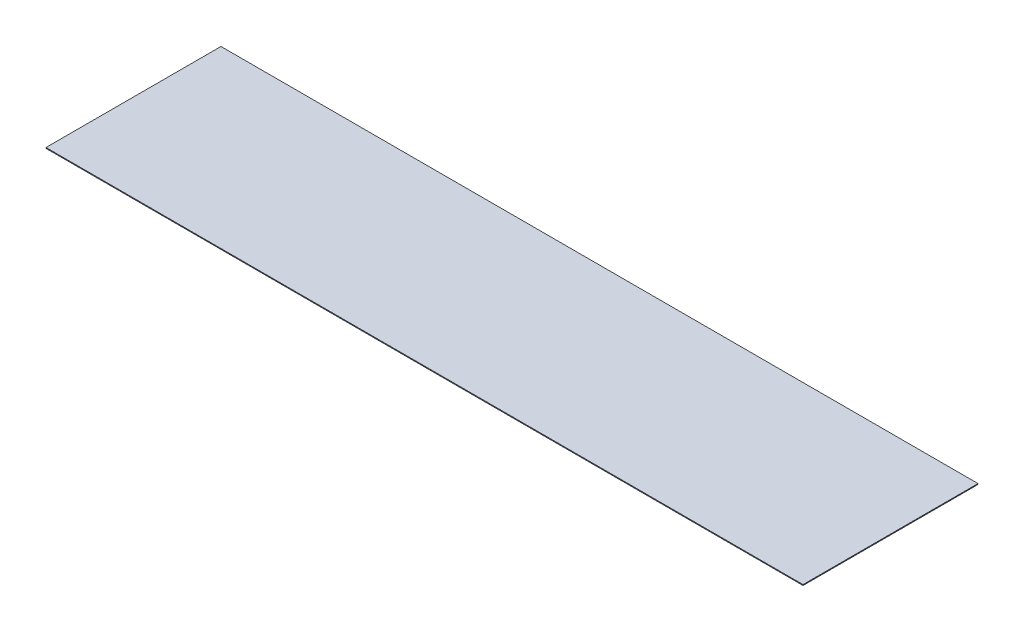
ISO-10303-21;
HEADER;
FILE_DESCRIPTION(('STEP AP214'),'2;1');
FILE_NAME('part.step','',(''),(''),'','','');
FILE_SCHEMA(('AUTOMOTIVE_DESIGN { 1 0 10303 214 1 1 1 1 }'));
ENDSEC;
DATA;
#1=APPLICATION_CONTEXT('core data for automotive mechanical design processes');
#2=APPLICATION_PROTOCOL_DEFINITION('international standard','automotive_design',2000,#1);
#3=PRODUCT_CONTEXT('',#1,'mechanical');
#4=PRODUCT('Part','Part','',(#3));
#5=PRODUCT_RELATED_PRODUCT_CATEGORY('part','',(#4));
#6=PRODUCT_DEFINITION_FORMATION('','',#4);
#7=PRODUCT_DEFINITION_CONTEXT('part definition',#1,'design');
#8=PRODUCT_DEFINITION('design','',#6,#7);
#9=PRODUCT_DEFINITION_SHAPE('','',#8);
#10=(LENGTH_UNIT() NAMED_UNIT(*) SI_UNIT(.MILLI.,.METRE.));
#11=(NAMED_UNIT(*) PLANE_ANGLE_UNIT() SI_UNIT($,.RADIAN.));
#12=(NAMED_UNIT(*) SI_UNIT($,.STERADIAN.) SOLID_ANGLE_UNIT());
#13=UNCERTAINTY_MEASURE_WITH_UNIT(LENGTH_MEASURE(1.E-05),#10,'distance_accuracy_value','');
#14=(GEOMETRIC_REPRESENTATION_CONTEXT(3) GLOBAL_UNCERTAINTY_ASSIGNED_CONTEXT((#13)) GLOBAL_UNIT_ASSIGNED_CONTEXT((#10,
#11,#12)) REPRESENTATION_CONTEXT('',''));
#15=CARTESIAN_POINT('',(0.,0.,0.));
#16=DIRECTION('',(0.,0.,1.));
#17=DIRECTION('',(1.,0.,0.));
#18=AXIS2_PLACEMENT_3D('',#15,#16,#17);
#19=CARTESIAN_POINT('',(900.,2.,-208.));
#20=DIRECTION('',(-1.,0.,0.));
#21=DIRECTION('',(0.,0.,1.));
#22=AXIS2_PLACEMENT_3D('',#19,#20,#21);
#23=PLANE('',#22);
#24=DIRECTION('',(0.,0.,-1.));
#25=VECTOR('',#24,1.);
#26=CARTESIAN_POINT('',(900.,0.,-208.));
#27=LINE('',#26,#25);
#28=CARTESIAN_POINT('',(900.,0.,208.));
#29=VERTEX_POINT('',#28);
#30=CARTESIAN_POINT('',(900.,0.,-208.));
#31=VERTEX_POINT('',#30);
#32=EDGE_CURVE('E96',#29,#31,#27,.T.);
#33=ORIENTED_EDGE('',*,*,#32,.T.);
#34=DIRECTION('',(0.,-1.,0.));
#35=VECTOR('',#34,1.);
#36=CARTESIAN_POINT('',(900.,2.,-208.));
#37=LINE('',#36,#35);
#38=CARTESIAN_POINT('',(900.,2.,-208.));
#39=VERTEX_POINT('',#38);
#40=EDGE_CURVE('E11',#39,#31,#37,.T.);
#41=ORIENTED_EDGE('',*,*,#40,.F.);
#42=DIRECTION('',(0.,0.,-1.));
#43=VECTOR('',#42,1.);
#44=CARTESIAN_POINT('',(900.,2.,-208.));
#45=LINE('',#44,#43);
#46=CARTESIAN_POINT('',(900.,2.,208.));
#47=VERTEX_POINT('',#46);
#48=EDGE_CURVE('E84',#47,#39,#45,.T.);
#49=ORIENTED_EDGE('',*,*,#48,.F.);
#50=DIRECTION('',(0.,-1.,0.));
#51=VECTOR('',#50,1.);
#52=CARTESIAN_POINT('',(900.,2.,208.));
#53=LINE('',#52,#51);
#54=EDGE_CURVE('E92',#47,#29,#53,.T.);
#55=ORIENTED_EDGE('',*,*,#54,.T.);
#56=EDGE_LOOP('',(#33,#41,#49,#55));
#57=FACE_BOUND('',#56,.T.);
#58=ADVANCED_FACE('F33',(#57),#23,.F.);
#59=CARTESIAN_POINT('',(-900.,2.,-208.));
#60=DIRECTION('',(0.,0.,1.));
#61=DIRECTION('',(1.,0.,0.));
#62=AXIS2_PLACEMENT_3D('',#59,#60,#61);
#63=PLANE('',#62);
#64=DIRECTION('',(-1.,0.,0.));
#65=VECTOR('',#64,1.);
#66=CARTESIAN_POINT('',(-900.,0.,-208.));
#67=LINE('',#66,#65);
#68=CARTESIAN_POINT('',(-900.,0.,-208.));
#69=VERTEX_POINT('',#68);
#70=EDGE_CURVE('E88',#31,#69,#67,.T.);
#71=ORIENTED_EDGE('',*,*,#70,.T.);
#72=DIRECTION('',(0.,-1.,0.));
#73=VECTOR('',#72,1.);
#74=CARTESIAN_POINT('',(-900.,2.,-208.));
#75=LINE('',#74,#73);
#76=CARTESIAN_POINT('',(-900.,2.,-208.));
#77=VERTEX_POINT('',#76);
#78=EDGE_CURVE('E41',#77,#69,#75,.T.);
#79=ORIENTED_EDGE('',*,*,#78,.F.);
#80=DIRECTION('',(-1.,0.,0.));
#81=VECTOR('',#80,1.);
#82=CARTESIAN_POINT('',(-900.,2.,-208.));
#83=LINE('',#82,#81);
#84=EDGE_CURVE('E79',#39,#77,#83,.T.);
#85=ORIENTED_EDGE('',*,*,#84,.F.);
#86=ORIENTED_EDGE('',*,*,#40,.T.);
#87=EDGE_LOOP('',(#71,#79,#85,#86));
#88=FACE_BOUND('',#87,.T.);
#89=ADVANCED_FACE('F87',(#88),#63,.F.);
#90=CARTESIAN_POINT('',(-900.,2.,-208.));
#91=DIRECTION('',(1.,0.,0.));
#92=DIRECTION('',(0.,0.,-1.));
#93=AXIS2_PLACEMENT_3D('',#90,#91,#92);
#94=PLANE('',#93);
#95=DIRECTION('',(0.,0.,1.));
#96=VECTOR('',#95,1.);
#97=CARTESIAN_POINT('',(-900.,0.,-208.));
#98=LINE('',#97,#96);
#99=CARTESIAN_POINT('',(-900.,0.,208.));
#100=VERTEX_POINT('',#99);
#101=EDGE_CURVE('E66',#69,#100,#98,.T.);
#102=ORIENTED_EDGE('',*,*,#101,.T.);
#103=DIRECTION('',(0.,-1.,0.));
#104=VECTOR('',#103,1.);
#105=CARTESIAN_POINT('',(-900.,2.,208.));
#106=LINE('',#105,#104);
#107=CARTESIAN_POINT('',(-900.,2.,208.));
#108=VERTEX_POINT('',#107);
#109=EDGE_CURVE('E89',#108,#100,#106,.T.);
#110=ORIENTED_EDGE('',*,*,#109,.F.);
#111=DIRECTION('',(0.,0.,1.));
#112=VECTOR('',#111,1.);
#113=CARTESIAN_POINT('',(-900.,2.,-208.));
#114=LINE('',#113,#112);
#115=EDGE_CURVE('E82',#77,#108,#114,.T.);
#116=ORIENTED_EDGE('',*,*,#115,.F.);
#117=ORIENTED_EDGE('',*,*,#78,.T.);
#118=EDGE_LOOP('',(#102,#110,#116,#117));
#119=FACE_BOUND('',#118,.T.);
#120=ADVANCED_FACE('F90',(#119),#94,.F.);
#121=CARTESIAN_POINT('',(-900.,2.,208.));
#122=DIRECTION('',(0.,0.,-1.));
#123=DIRECTION('',(-1.,0.,0.));
#124=AXIS2_PLACEMENT_3D('',#121,#122,#123);
#125=PLANE('',#124);
#126=DIRECTION('',(1.,0.,0.));
#127=VECTOR('',#126,1.);
#128=CARTESIAN_POINT('',(-900.,0.,208.));
#129=LINE('',#128,#127);
#130=EDGE_CURVE('E72',#100,#29,#129,.T.);
#131=ORIENTED_EDGE('',*,*,#130,.T.);
#132=ORIENTED_EDGE('',*,*,#54,.F.);
#133=DIRECTION('',(1.,0.,0.));
#134=VECTOR('',#133,1.);
#135=CARTESIAN_POINT('',(-900.,2.,208.));
#136=LINE('',#135,#134);
#137=EDGE_CURVE('E49',#108,#47,#136,.T.);
#138=ORIENTED_EDGE('',*,*,#137,.F.);
#139=ORIENTED_EDGE('',*,*,#109,.T.);
#140=EDGE_LOOP('',(#131,#132,#138,#139));
#141=FACE_BOUND('',#140,.T.);
#142=ADVANCED_FACE('F103',(#141),#125,.F.);
#143=CARTESIAN_POINT('',(0.,2.,0.));
#144=DIRECTION('',(0.,1.,0.));
#145=DIRECTION('',(0.,0.,1.));
#146=AXIS2_PLACEMENT_3D('',#143,#144,#145);
#147=PLANE('',#146);
#148=ORIENTED_EDGE('',*,*,#48,.T.);
#149=ORIENTED_EDGE('',*,*,#84,.T.);
#150=ORIENTED_EDGE('',*,*,#115,.T.);
#151=ORIENTED_EDGE('',*,*,#137,.T.);
#152=EDGE_LOOP('',(#148,#149,#150,#151));
#153=FACE_BOUND('',#152,.T.);
#154=ADVANCED_FACE('F80',(#153),#147,.T.);
#155=CARTESIAN_POINT('',(0.,0.,0.));
#156=DIRECTION('',(0.,1.,0.));
#157=DIRECTION('',(0.,0.,1.));
#158=AXIS2_PLACEMENT_3D('',#155,#156,#157);
#159=PLANE('',#158);
#160=ORIENTED_EDGE('',*,*,#32,.F.);
#161=ORIENTED_EDGE('',*,*,#130,.F.);
#162=ORIENTED_EDGE('',*,*,#101,.F.);
#163=ORIENTED_EDGE('',*,*,#70,.F.);
#164=EDGE_LOOP('',(#160,#161,#162,#163));
#165=FACE_BOUND('',#164,.T.);
#166=ADVANCED_FACE('F106',(#165),#159,.F.);
#167=CLOSED_SHELL('',(#58,#89,#120,#142,#154,#166));
#168=MANIFOLD_SOLID_BREP('B2',#167);
#169=ADVANCED_BREP_SHAPE_REPRESENTATION('',(#18,#168),#14);
#170=SHAPE_DEFINITION_REPRESENTATION(#9,#169);
ENDSEC;
END-ISO-10303-21;
